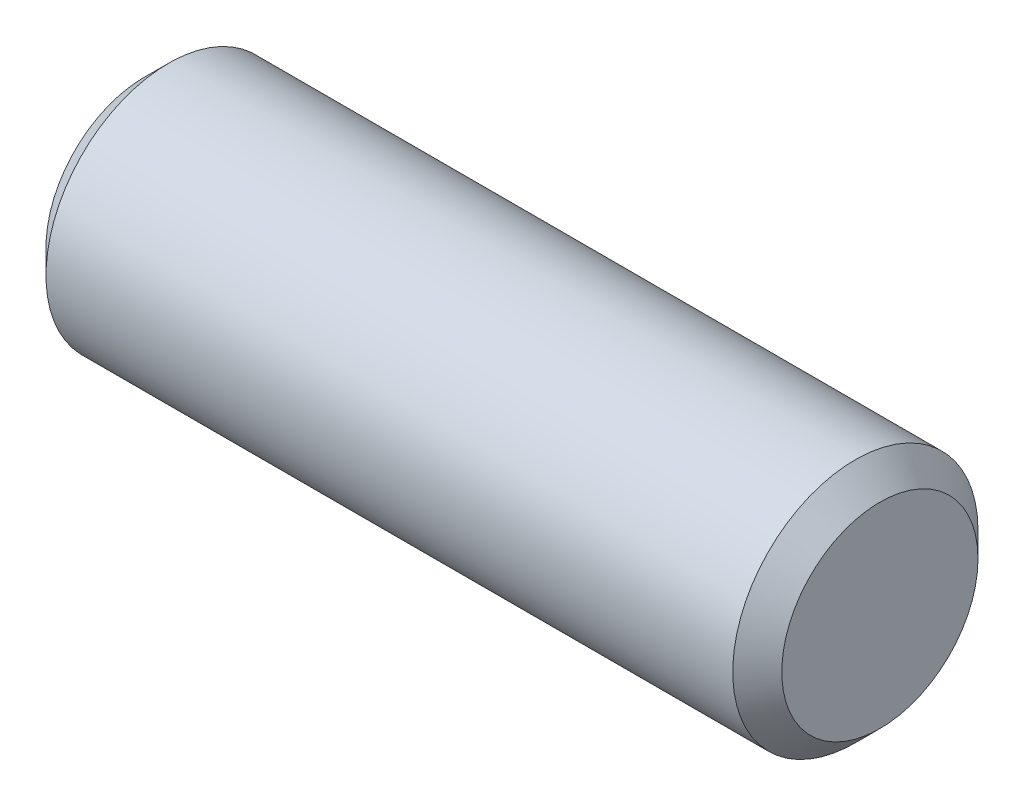
ISO-10303-21;
HEADER;
FILE_DESCRIPTION(('STEP AP214'),'2;1');
FILE_NAME('part.step','',(''),(''),'','','');
FILE_SCHEMA(('AUTOMOTIVE_DESIGN { 1 0 10303 214 1 1 1 1 }'));
ENDSEC;
DATA;
#1=APPLICATION_CONTEXT('core data for automotive mechanical design processes');
#2=APPLICATION_PROTOCOL_DEFINITION('international standard','automotive_design',2000,#1);
#3=PRODUCT_CONTEXT('',#1,'mechanical');
#4=PRODUCT('Part','Part','',(#3));
#5=PRODUCT_RELATED_PRODUCT_CATEGORY('part','',(#4));
#6=PRODUCT_DEFINITION_FORMATION('','',#4);
#7=PRODUCT_DEFINITION_CONTEXT('part definition',#1,'design');
#8=PRODUCT_DEFINITION('design','',#6,#7);
#9=PRODUCT_DEFINITION_SHAPE('','',#8);
#10=(LENGTH_UNIT() NAMED_UNIT(*) SI_UNIT(.MILLI.,.METRE.));
#11=(NAMED_UNIT(*) PLANE_ANGLE_UNIT() SI_UNIT($,.RADIAN.));
#12=(NAMED_UNIT(*) SI_UNIT($,.STERADIAN.) SOLID_ANGLE_UNIT());
#13=UNCERTAINTY_MEASURE_WITH_UNIT(LENGTH_MEASURE(1.E-05),#10,'distance_accuracy_value','');
#14=(GEOMETRIC_REPRESENTATION_CONTEXT(3) GLOBAL_UNCERTAINTY_ASSIGNED_CONTEXT((#13)) GLOBAL_UNIT_ASSIGNED_CONTEXT((#10,
#11,#12)) REPRESENTATION_CONTEXT('',''));
#15=CARTESIAN_POINT('',(0.,0.,0.));
#16=DIRECTION('',(0.,0.,1.));
#17=DIRECTION('',(1.,0.,0.));
#18=AXIS2_PLACEMENT_3D('',#15,#16,#17);
#19=CARTESIAN_POINT('',(-7.14375,0.,0.));
#20=DIRECTION('',(1.,0.,0.));
#21=DIRECTION('',(0.,0.,-1.));
#22=AXIS2_PLACEMENT_3D('',#19,#20,#21);
#23=CYLINDRICAL_SURFACE('',#22,2.38125);
#24=CARTESIAN_POINT('',(6.66749999999999,0.,0.));
#25=DIRECTION('',(1.,0.,0.));
#26=DIRECTION('',(0.,0.,-1.));
#27=AXIS2_PLACEMENT_3D('',#24,#25,#26);
#28=CIRCLE('',#27,2.38125);
#29=CARTESIAN_POINT('',(6.66749999999999,0.,-2.38125));
#30=VERTEX_POINT('',#29);
#31=EDGE_CURVE('E44',#30,#30,#28,.F.);
#32=ORIENTED_EDGE('',*,*,#31,.T.);
#33=EDGE_LOOP('',(#32));
#34=FACE_BOUND('',#33,.T.);
#35=CARTESIAN_POINT('',(-6.6675,0.,0.));
#36=DIRECTION('',(1.,0.,0.));
#37=DIRECTION('',(0.,0.,-1.));
#38=AXIS2_PLACEMENT_3D('',#35,#36,#37);
#39=CIRCLE('',#38,2.38125);
#40=CARTESIAN_POINT('',(-6.6675,0.,-2.38125));
#41=VERTEX_POINT('',#40);
#42=EDGE_CURVE('E50',#41,#41,#39,.T.);
#43=ORIENTED_EDGE('',*,*,#42,.T.);
#44=EDGE_LOOP('',(#43));
#45=FACE_BOUND('',#44,.T.);
#46=ADVANCED_FACE('F36',(#34,#45),#23,.T.);
#47=CARTESIAN_POINT('',(-7.14375,0.,0.));
#48=DIRECTION('',(1.,0.,0.));
#49=DIRECTION('',(0.,0.,-1.));
#50=AXIS2_PLACEMENT_3D('',#47,#48,#49);
#51=PLANE('',#50);
#52=CARTESIAN_POINT('',(-7.14375,0.,0.));
#53=DIRECTION('',(1.,0.,0.));
#54=DIRECTION('',(0.,0.,-1.));
#55=AXIS2_PLACEMENT_3D('',#52,#53,#54);
#56=CIRCLE('',#55,1.905);
#57=CARTESIAN_POINT('',(-7.14375,0.,-1.905));
#58=VERTEX_POINT('',#57);
#59=EDGE_CURVE('E10',#58,#58,#56,.F.);
#60=ORIENTED_EDGE('',*,*,#59,.T.);
#61=EDGE_LOOP('',(#60));
#62=FACE_BOUND('',#61,.T.);
#63=ADVANCED_FACE('F71',(#62),#51,.F.);
#64=CARTESIAN_POINT('',(7.14375,0.,0.));
#65=DIRECTION('',(1.,0.,0.));
#66=DIRECTION('',(0.,0.,-1.));
#67=AXIS2_PLACEMENT_3D('',#64,#65,#66);
#68=PLANE('',#67);
#69=CARTESIAN_POINT('',(7.14375,0.,0.));
#70=DIRECTION('',(1.,0.,0.));
#71=DIRECTION('',(0.,0.,-1.));
#72=AXIS2_PLACEMENT_3D('',#69,#70,#71);
#73=CIRCLE('',#72,1.905);
#74=CARTESIAN_POINT('',(7.14375,0.,-1.905));
#75=VERTEX_POINT('',#74);
#76=EDGE_CURVE('E55',#75,#75,#73,.T.);
#77=ORIENTED_EDGE('',*,*,#76,.T.);
#78=EDGE_LOOP('',(#77));
#79=FACE_BOUND('',#78,.T.);
#80=ADVANCED_FACE('F61',(#79),#68,.T.);
#81=CARTESIAN_POINT('',(7.14375,0.,0.));
#82=DIRECTION('',(-1.,0.,0.));
#83=DIRECTION('',(0.,0.,1.));
#84=AXIS2_PLACEMENT_3D('',#81,#82,#83);
#85=CONICAL_SURFACE('',#84,1.905,0.785398163397447);
#86=ORIENTED_EDGE('',*,*,#31,.F.);
#87=EDGE_LOOP('',(#86));
#88=FACE_BOUND('',#87,.T.);
#89=ORIENTED_EDGE('',*,*,#76,.F.);
#90=EDGE_LOOP('',(#89));
#91=FACE_BOUND('',#90,.T.);
#92=ADVANCED_FACE('F63',(#88,#91),#85,.T.);
#93=CARTESIAN_POINT('',(-6.6675,0.,0.));
#94=DIRECTION('',(1.,0.,0.));
#95=DIRECTION('',(0.,0.,-1.));
#96=AXIS2_PLACEMENT_3D('',#93,#94,#95);
#97=CONICAL_SURFACE('',#96,2.38125,0.785398163397449);
#98=ORIENTED_EDGE('',*,*,#59,.F.);
#99=EDGE_LOOP('',(#98));
#100=FACE_BOUND('',#99,.T.);
#101=ORIENTED_EDGE('',*,*,#42,.F.);
#102=EDGE_LOOP('',(#101));
#103=FACE_BOUND('',#102,.T.);
#104=ADVANCED_FACE('F38',(#100,#103),#97,.T.);
#105=CLOSED_SHELL('',(#46,#63,#80,#92,#104));
#106=MANIFOLD_SOLID_BREP('B2',#105);
#107=ADVANCED_BREP_SHAPE_REPRESENTATION('',(#18,#106),#14);
#108=SHAPE_DEFINITION_REPRESENTATION(#9,#107);
ENDSEC;
END-ISO-10303-21;
